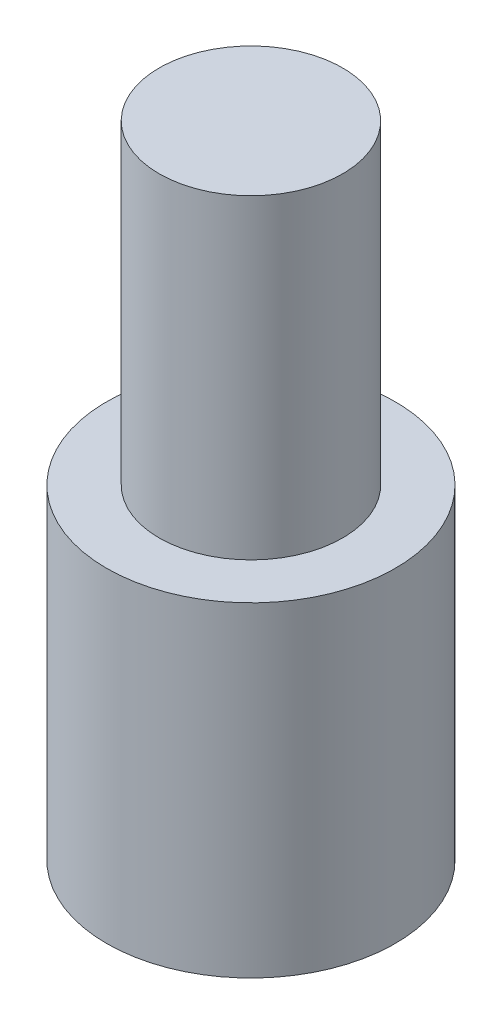
ISO-10303-21;
HEADER;
FILE_DESCRIPTION(('STEP AP214'),'2;1');
FILE_NAME('part.step','',(''),(''),'','','');
FILE_SCHEMA(('AUTOMOTIVE_DESIGN { 1 0 10303 214 1 1 1 1 }'));
ENDSEC;
DATA;
#1=APPLICATION_CONTEXT('core data for automotive mechanical design processes');
#2=APPLICATION_PROTOCOL_DEFINITION('international standard','automotive_design',2000,#1);
#3=PRODUCT_CONTEXT('',#1,'mechanical');
#4=PRODUCT('Part','Part','',(#3));
#5=PRODUCT_RELATED_PRODUCT_CATEGORY('part','',(#4));
#6=PRODUCT_DEFINITION_FORMATION('','',#4);
#7=PRODUCT_DEFINITION_CONTEXT('part definition',#1,'design');
#8=PRODUCT_DEFINITION('design','',#6,#7);
#9=PRODUCT_DEFINITION_SHAPE('','',#8);
#10=(LENGTH_UNIT() NAMED_UNIT(*) SI_UNIT(.MILLI.,.METRE.));
#11=(NAMED_UNIT(*) PLANE_ANGLE_UNIT() SI_UNIT($,.RADIAN.));
#12=(NAMED_UNIT(*) SI_UNIT($,.STERADIAN.) SOLID_ANGLE_UNIT());
#13=UNCERTAINTY_MEASURE_WITH_UNIT(LENGTH_MEASURE(1.E-05),#10,'distance_accuracy_value','');
#14=(GEOMETRIC_REPRESENTATION_CONTEXT(3) GLOBAL_UNCERTAINTY_ASSIGNED_CONTEXT((#13)) GLOBAL_UNIT_ASSIGNED_CONTEXT((#10,
#11,#12)) REPRESENTATION_CONTEXT('',''));
#15=CARTESIAN_POINT('',(0.,0.,0.));
#16=DIRECTION('',(0.,0.,1.));
#17=DIRECTION('',(1.,0.,0.));
#18=AXIS2_PLACEMENT_3D('',#15,#16,#17);
#19=CARTESIAN_POINT('',(-14.4643153385133,17.,-6.75176354405766));
#20=DIRECTION('',(0.,-1.,0.));
#21=DIRECTION('',(0.,0.,-1.));
#22=AXIS2_PLACEMENT_3D('',#19,#20,#21);
#23=CYLINDRICAL_SURFACE('',#22,7.55);
#24=CARTESIAN_POINT('',(-14.4643153385133,17.,-6.75176354405766));
#25=DIRECTION('',(0.,1.,0.));
#26=DIRECTION('',(0.,0.,1.));
#27=AXIS2_PLACEMENT_3D('',#24,#25,#26);
#28=CIRCLE('',#27,7.55);
#29=CARTESIAN_POINT('',(-14.4643153385133,17.,0.798236455942342));
#30=VERTEX_POINT('',#29);
#31=EDGE_CURVE('E45',#30,#30,#28,.T.);
#32=ORIENTED_EDGE('',*,*,#31,.F.);
#33=EDGE_LOOP('',(#32));
#34=FACE_BOUND('',#33,.T.);
#35=CARTESIAN_POINT('',(-14.4643153385133,0.,-6.75176354405766));
#36=DIRECTION('',(0.,1.,0.));
#37=DIRECTION('',(0.,0.,1.));
#38=AXIS2_PLACEMENT_3D('',#35,#36,#37);
#39=CIRCLE('',#38,7.55);
#40=CARTESIAN_POINT('',(-14.4643153385133,0.,0.798236455942342));
#41=VERTEX_POINT('',#40);
#42=EDGE_CURVE('E40',#41,#41,#39,.T.);
#43=ORIENTED_EDGE('',*,*,#42,.T.);
#44=EDGE_LOOP('',(#43));
#45=FACE_BOUND('',#44,.T.);
#46=ADVANCED_FACE('F37',(#34,#45),#23,.T.);
#47=CARTESIAN_POINT('',(-14.4643153385133,17.,-6.75176354405766));
#48=DIRECTION('',(0.,1.,0.));
#49=DIRECTION('',(0.,0.,1.));
#50=AXIS2_PLACEMENT_3D('',#47,#48,#49);
#51=PLANE('',#50);
#52=CARTESIAN_POINT('',(-14.4643153385133,17.,-6.75176354405766));
#53=DIRECTION('',(0.,1.,0.));
#54=DIRECTION('',(0.,0.,1.));
#55=AXIS2_PLACEMENT_3D('',#52,#53,#54);
#56=CIRCLE('',#55,4.8);
#57=CARTESIAN_POINT('',(-14.4643153385133,17.,-1.95176354405766));
#58=VERTEX_POINT('',#57);
#59=EDGE_CURVE('E10',#58,#58,#56,.T.);
#60=ORIENTED_EDGE('',*,*,#59,.F.);
#61=EDGE_LOOP('',(#60));
#62=FACE_BOUND('',#61,.T.);
#63=ORIENTED_EDGE('',*,*,#31,.T.);
#64=EDGE_LOOP('',(#63));
#65=FACE_BOUND('',#64,.T.);
#66=ADVANCED_FACE('F82',(#62,#65),#51,.T.);
#67=CARTESIAN_POINT('',(-14.4643153385133,0.,-6.75176354405766));
#68=DIRECTION('',(0.,1.,0.));
#69=DIRECTION('',(0.,0.,1.));
#70=AXIS2_PLACEMENT_3D('',#67,#68,#69);
#71=PLANE('',#70);
#72=CARTESIAN_POINT('',(-14.4643153385133,0.,-6.75176354405766));
#73=DIRECTION('',(0.,-1.,0.));
#74=DIRECTION('',(0.,0.,-1.));
#75=AXIS2_PLACEMENT_3D('',#72,#73,#74);
#76=CIRCLE('',#75,5.15);
#77=CARTESIAN_POINT('',(-14.4643153385133,0.,-11.9017635440577));
#78=VERTEX_POINT('',#77);
#79=EDGE_CURVE('E58',#78,#78,#76,.T.);
#80=ORIENTED_EDGE('',*,*,#79,.F.);
#81=EDGE_LOOP('',(#80));
#82=FACE_BOUND('',#81,.T.);
#83=ORIENTED_EDGE('',*,*,#42,.F.);
#84=EDGE_LOOP('',(#83));
#85=FACE_BOUND('',#84,.T.);
#86=ADVANCED_FACE('F87',(#82,#85),#71,.F.);
#87=CARTESIAN_POINT('',(-14.4643153385133,2.,-6.75176354405766));
#88=DIRECTION('',(0.,-1.,0.));
#89=DIRECTION('',(0.,0.,-1.));
#90=AXIS2_PLACEMENT_3D('',#87,#88,#89);
#91=CYLINDRICAL_SURFACE('',#90,5.15);
#92=CARTESIAN_POINT('',(-14.4643153385133,2.,-6.75176354405766));
#93=DIRECTION('',(0.,-1.,0.));
#94=DIRECTION('',(0.,0.,-1.));
#95=AXIS2_PLACEMENT_3D('',#92,#93,#94);
#96=CIRCLE('',#95,5.15);
#97=CARTESIAN_POINT('',(-14.4643153385133,2.,-11.9017635440577));
#98=VERTEX_POINT('',#97);
#99=EDGE_CURVE('E54',#98,#98,#96,.T.);
#100=ORIENTED_EDGE('',*,*,#99,.F.);
#101=EDGE_LOOP('',(#100));
#102=FACE_BOUND('',#101,.T.);
#103=ORIENTED_EDGE('',*,*,#79,.T.);
#104=EDGE_LOOP('',(#103));
#105=FACE_BOUND('',#104,.T.);
#106=ADVANCED_FACE('F78',(#102,#105),#91,.F.);
#107=CARTESIAN_POINT('',(-14.4643153385133,2.,-6.75176354405766));
#108=DIRECTION('',(0.,-1.,0.));
#109=DIRECTION('',(0.,0.,-1.));
#110=AXIS2_PLACEMENT_3D('',#107,#108,#109);
#111=PLANE('',#110);
#112=ORIENTED_EDGE('',*,*,#99,.T.);
#113=EDGE_LOOP('',(#112));
#114=FACE_BOUND('',#113,.T.);
#115=ADVANCED_FACE('F71',(#114),#111,.T.);
#116=CARTESIAN_POINT('',(-14.4643153385133,33.5,-6.75176354405766));
#117=DIRECTION('',(0.,-1.,0.));
#118=DIRECTION('',(0.,0.,-1.));
#119=AXIS2_PLACEMENT_3D('',#116,#117,#118);
#120=CYLINDRICAL_SURFACE('',#119,4.8);
#121=CARTESIAN_POINT('',(-14.4643153385133,33.5,-6.75176354405766));
#122=DIRECTION('',(0.,1.,0.));
#123=DIRECTION('',(0.,0.,1.));
#124=AXIS2_PLACEMENT_3D('',#121,#122,#123);
#125=CIRCLE('',#124,4.8);
#126=CARTESIAN_POINT('',(-14.4643153385133,33.5,-1.95176354405766));
#127=VERTEX_POINT('',#126);
#128=EDGE_CURVE('E53',#127,#127,#125,.T.);
#129=ORIENTED_EDGE('',*,*,#128,.F.);
#130=EDGE_LOOP('',(#129));
#131=FACE_BOUND('',#130,.T.);
#132=ORIENTED_EDGE('',*,*,#59,.T.);
#133=EDGE_LOOP('',(#132));
#134=FACE_BOUND('',#133,.T.);
#135=ADVANCED_FACE('F69',(#131,#134),#120,.T.);
#136=CARTESIAN_POINT('',(-14.4643153385133,33.5,-6.75176354405766));
#137=DIRECTION('',(0.,1.,0.));
#138=DIRECTION('',(0.,0.,1.));
#139=AXIS2_PLACEMENT_3D('',#136,#137,#138);
#140=PLANE('',#139);
#141=ORIENTED_EDGE('',*,*,#128,.T.);
#142=EDGE_LOOP('',(#141));
#143=FACE_BOUND('',#142,.T.);
#144=ADVANCED_FACE('F67',(#143),#140,.T.);
#145=CLOSED_SHELL('',(#46,#66,#86,#106,#115,#135,#144));
#146=MANIFOLD_SOLID_BREP('B2',#145);
#147=ADVANCED_BREP_SHAPE_REPRESENTATION('',(#18,#146),#14);
#148=SHAPE_DEFINITION_REPRESENTATION(#9,#147);
ENDSEC;
END-ISO-10303-21;
